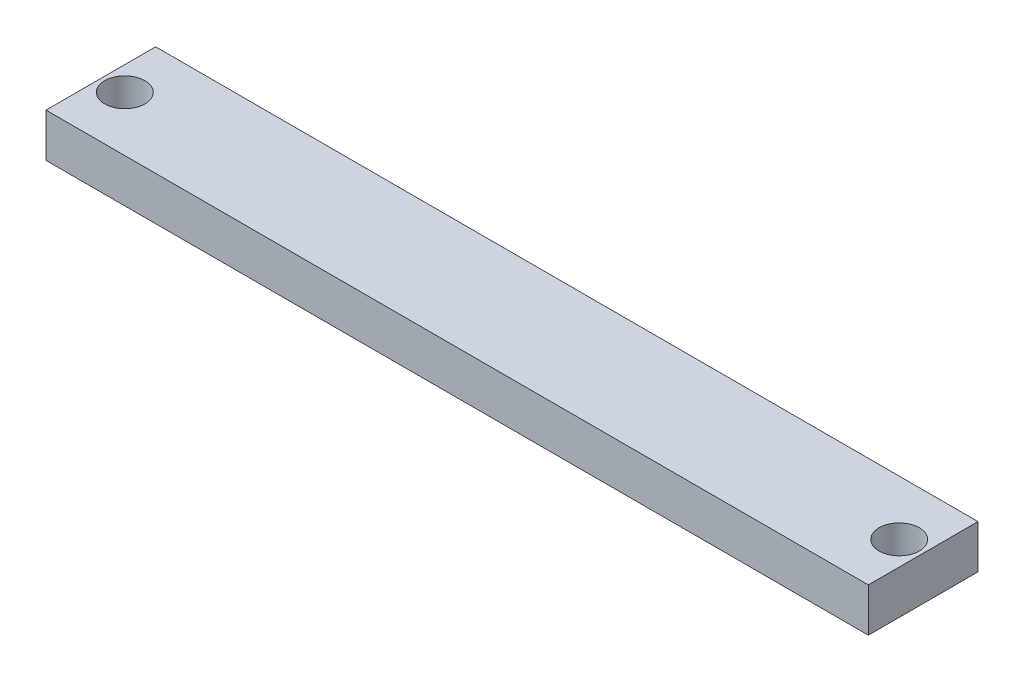
ISO-10303-21;
HEADER;
FILE_DESCRIPTION(('STEP AP214'),'2;1');
FILE_NAME('part.step','',(''),(''),'','','');
FILE_SCHEMA(('AUTOMOTIVE_DESIGN { 1 0 10303 214 1 1 1 1 }'));
ENDSEC;
DATA;
#1=APPLICATION_CONTEXT('core data for automotive mechanical design processes');
#2=APPLICATION_PROTOCOL_DEFINITION('international standard','automotive_design',2000,#1);
#3=PRODUCT_CONTEXT('',#1,'mechanical');
#4=PRODUCT('Part','Part','',(#3));
#5=PRODUCT_RELATED_PRODUCT_CATEGORY('part','',(#4));
#6=PRODUCT_DEFINITION_FORMATION('','',#4);
#7=PRODUCT_DEFINITION_CONTEXT('part definition',#1,'design');
#8=PRODUCT_DEFINITION('design','',#6,#7);
#9=PRODUCT_DEFINITION_SHAPE('','',#8);
#10=(LENGTH_UNIT() NAMED_UNIT(*) SI_UNIT(.MILLI.,.METRE.));
#11=(NAMED_UNIT(*) PLANE_ANGLE_UNIT() SI_UNIT($,.RADIAN.));
#12=(NAMED_UNIT(*) SI_UNIT($,.STERADIAN.) SOLID_ANGLE_UNIT());
#13=UNCERTAINTY_MEASURE_WITH_UNIT(LENGTH_MEASURE(1.E-05),#10,'distance_accuracy_value','');
#14=(GEOMETRIC_REPRESENTATION_CONTEXT(3) GLOBAL_UNCERTAINTY_ASSIGNED_CONTEXT((#13)) GLOBAL_UNIT_ASSIGNED_CONTEXT((#10,
#11,#12)) REPRESENTATION_CONTEXT('',''));
#15=CARTESIAN_POINT('',(0.,0.,0.));
#16=DIRECTION('',(0.,0.,1.));
#17=DIRECTION('',(1.,0.,0.));
#18=AXIS2_PLACEMENT_3D('',#15,#16,#17);
#19=CARTESIAN_POINT('',(0.,3.18,0.));
#20=DIRECTION('',(0.,1.,0.));
#21=DIRECTION('',(0.,0.,1.));
#22=AXIS2_PLACEMENT_3D('',#19,#20,#21);
#23=PLANE('',#22);
#24=CARTESIAN_POINT('',(-28.25,3.18,0.));
#25=DIRECTION('',(0.,1.,0.));
#26=DIRECTION('',(0.,0.,1.));
#27=AXIS2_PLACEMENT_3D('',#24,#25,#26);
#28=CIRCLE('',#27,1.47);
#29=CARTESIAN_POINT('',(-28.25,3.18,-1.47));
#30=VERTEX_POINT('',#29);
#31=EDGE_CURVE('E112',#30,#30,#28,.T.);
#32=ORIENTED_EDGE('',*,*,#31,.F.);
#33=EDGE_LOOP('',(#32));
#34=FACE_BOUND('',#33,.T.);
#35=DIRECTION('',(0.,0.,-1.));
#36=VECTOR('',#35,1.);
#37=CARTESIAN_POINT('',(30.,3.18,-4.));
#38=LINE('',#37,#36);
#39=CARTESIAN_POINT('',(30.,3.18,4.));
#40=VERTEX_POINT('',#39);
#41=CARTESIAN_POINT('',(30.,3.18,-4.));
#42=VERTEX_POINT('',#41);
#43=EDGE_CURVE('E92',#40,#42,#38,.T.);
#44=ORIENTED_EDGE('',*,*,#43,.T.);
#45=DIRECTION('',(-1.,0.,0.));
#46=VECTOR('',#45,1.);
#47=CARTESIAN_POINT('',(-30.,3.18,-4.));
#48=LINE('',#47,#46);
#49=CARTESIAN_POINT('',(-30.,3.18,-4.));
#50=VERTEX_POINT('',#49);
#51=EDGE_CURVE('E87',#42,#50,#48,.T.);
#52=ORIENTED_EDGE('',*,*,#51,.T.);
#53=DIRECTION('',(0.,0.,1.));
#54=VECTOR('',#53,1.);
#55=CARTESIAN_POINT('',(-30.,3.18,-4.));
#56=LINE('',#55,#54);
#57=CARTESIAN_POINT('',(-30.,3.18,4.));
#58=VERTEX_POINT('',#57);
#59=EDGE_CURVE('E90',#50,#58,#56,.T.);
#60=ORIENTED_EDGE('',*,*,#59,.T.);
#61=DIRECTION('',(1.,0.,0.));
#62=VECTOR('',#61,1.);
#63=CARTESIAN_POINT('',(-30.,3.18,4.));
#64=LINE('',#63,#62);
#65=EDGE_CURVE('E57',#58,#40,#64,.T.);
#66=ORIENTED_EDGE('',*,*,#65,.T.);
#67=EDGE_LOOP('',(#44,#52,#60,#66));
#68=FACE_BOUND('',#67,.T.);
#69=CARTESIAN_POINT('',(28.25,3.18,0.));
#70=DIRECTION('',(0.,1.,0.));
#71=DIRECTION('',(0.,0.,-1.));
#72=AXIS2_PLACEMENT_3D('',#69,#70,#71);
#73=CIRCLE('',#72,1.47);
#74=CARTESIAN_POINT('',(28.25,3.18,-1.47));
#75=VERTEX_POINT('',#74);
#76=EDGE_CURVE('E134',#75,#75,#73,.T.);
#77=ORIENTED_EDGE('',*,*,#76,.F.);
#78=EDGE_LOOP('',(#77));
#79=FACE_BOUND('',#78,.T.);
#80=ADVANCED_FACE('F39',(#34,#68,#79),#23,.T.);
#81=CARTESIAN_POINT('',(0.,0.,0.));
#82=DIRECTION('',(0.,1.,0.));
#83=DIRECTION('',(0.,0.,1.));
#84=AXIS2_PLACEMENT_3D('',#81,#82,#83);
#85=PLANE('',#84);
#86=DIRECTION('',(0.,0.,-1.));
#87=VECTOR('',#86,1.);
#88=CARTESIAN_POINT('',(30.,0.,-4.));
#89=LINE('',#88,#87);
#90=CARTESIAN_POINT('',(30.,0.,4.));
#91=VERTEX_POINT('',#90);
#92=CARTESIAN_POINT('',(30.,0.,-4.));
#93=VERTEX_POINT('',#92);
#94=EDGE_CURVE('E108',#91,#93,#89,.T.);
#95=ORIENTED_EDGE('',*,*,#94,.F.);
#96=DIRECTION('',(1.,0.,0.));
#97=VECTOR('',#96,1.);
#98=CARTESIAN_POINT('',(-30.,0.,4.));
#99=LINE('',#98,#97);
#100=CARTESIAN_POINT('',(-30.,0.,4.));
#101=VERTEX_POINT('',#100);
#102=EDGE_CURVE('E80',#101,#91,#99,.T.);
#103=ORIENTED_EDGE('',*,*,#102,.F.);
#104=DIRECTION('',(0.,0.,1.));
#105=VECTOR('',#104,1.);
#106=CARTESIAN_POINT('',(-30.,0.,-4.));
#107=LINE('',#106,#105);
#108=CARTESIAN_POINT('',(-30.,0.,-4.));
#109=VERTEX_POINT('',#108);
#110=EDGE_CURVE('E74',#109,#101,#107,.T.);
#111=ORIENTED_EDGE('',*,*,#110,.F.);
#112=DIRECTION('',(-1.,0.,0.));
#113=VECTOR('',#112,1.);
#114=CARTESIAN_POINT('',(-30.,0.,-4.));
#115=LINE('',#114,#113);
#116=EDGE_CURVE('E97',#93,#109,#115,.T.);
#117=ORIENTED_EDGE('',*,*,#116,.F.);
#118=EDGE_LOOP('',(#95,#103,#111,#117));
#119=FACE_BOUND('',#118,.T.);
#120=CARTESIAN_POINT('',(-28.25,0.,0.));
#121=DIRECTION('',(0.,1.,0.));
#122=DIRECTION('',(0.,0.,1.));
#123=AXIS2_PLACEMENT_3D('',#120,#121,#122);
#124=CIRCLE('',#123,1.47);
#125=CARTESIAN_POINT('',(-28.25,0.,-1.47));
#126=VERTEX_POINT('',#125);
#127=EDGE_CURVE('E130',#126,#126,#124,.T.);
#128=ORIENTED_EDGE('',*,*,#127,.T.);
#129=EDGE_LOOP('',(#128));
#130=FACE_BOUND('',#129,.T.);
#131=CARTESIAN_POINT('',(28.25,0.,0.));
#132=DIRECTION('',(0.,1.,0.));
#133=DIRECTION('',(0.,0.,-1.));
#134=AXIS2_PLACEMENT_3D('',#131,#132,#133);
#135=CIRCLE('',#134,1.47);
#136=CARTESIAN_POINT('',(28.25,0.,-1.47));
#137=VERTEX_POINT('',#136);
#138=EDGE_CURVE('E138',#137,#137,#135,.T.);
#139=ORIENTED_EDGE('',*,*,#138,.T.);
#140=EDGE_LOOP('',(#139));
#141=FACE_BOUND('',#140,.T.);
#142=ADVANCED_FACE('F125',(#119,#130,#141),#85,.F.);
#143=CARTESIAN_POINT('',(30.,3.18,-4.));
#144=DIRECTION('',(-1.,0.,0.));
#145=DIRECTION('',(0.,0.,1.));
#146=AXIS2_PLACEMENT_3D('',#143,#144,#145);
#147=PLANE('',#146);
#148=ORIENTED_EDGE('',*,*,#94,.T.);
#149=DIRECTION('',(0.,-1.,0.));
#150=VECTOR('',#149,1.);
#151=CARTESIAN_POINT('',(30.,3.18,-4.));
#152=LINE('',#151,#150);
#153=EDGE_CURVE('E11',#42,#93,#152,.T.);
#154=ORIENTED_EDGE('',*,*,#153,.F.);
#155=ORIENTED_EDGE('',*,*,#43,.F.);
#156=DIRECTION('',(0.,-1.,0.));
#157=VECTOR('',#156,1.);
#158=CARTESIAN_POINT('',(30.,3.18,4.));
#159=LINE('',#158,#157);
#160=EDGE_CURVE('E104',#40,#91,#159,.T.);
#161=ORIENTED_EDGE('',*,*,#160,.T.);
#162=EDGE_LOOP('',(#148,#154,#155,#161));
#163=FACE_BOUND('',#162,.T.);
#164=ADVANCED_FACE('F41',(#163),#147,.F.);
#165=CARTESIAN_POINT('',(-30.,3.18,-4.));
#166=DIRECTION('',(0.,0.,1.));
#167=DIRECTION('',(1.,0.,0.));
#168=AXIS2_PLACEMENT_3D('',#165,#166,#167);
#169=PLANE('',#168);
#170=ORIENTED_EDGE('',*,*,#116,.T.);
#171=DIRECTION('',(0.,-1.,0.));
#172=VECTOR('',#171,1.);
#173=CARTESIAN_POINT('',(-30.,3.18,-4.));
#174=LINE('',#173,#172);
#175=EDGE_CURVE('E49',#50,#109,#174,.T.);
#176=ORIENTED_EDGE('',*,*,#175,.F.);
#177=ORIENTED_EDGE('',*,*,#51,.F.);
#178=ORIENTED_EDGE('',*,*,#153,.T.);
#179=EDGE_LOOP('',(#170,#176,#177,#178));
#180=FACE_BOUND('',#179,.T.);
#181=ADVANCED_FACE('F96',(#180),#169,.F.);
#182=CARTESIAN_POINT('',(-30.,3.18,-4.));
#183=DIRECTION('',(1.,0.,0.));
#184=DIRECTION('',(0.,0.,-1.));
#185=AXIS2_PLACEMENT_3D('',#182,#183,#184);
#186=PLANE('',#185);
#187=ORIENTED_EDGE('',*,*,#110,.T.);
#188=DIRECTION('',(0.,-1.,0.));
#189=VECTOR('',#188,1.);
#190=CARTESIAN_POINT('',(-30.,3.18,4.));
#191=LINE('',#190,#189);
#192=EDGE_CURVE('E99',#58,#101,#191,.T.);
#193=ORIENTED_EDGE('',*,*,#192,.F.);
#194=ORIENTED_EDGE('',*,*,#59,.F.);
#195=ORIENTED_EDGE('',*,*,#175,.T.);
#196=EDGE_LOOP('',(#187,#193,#194,#195));
#197=FACE_BOUND('',#196,.T.);
#198=ADVANCED_FACE('F100',(#197),#186,.F.);
#199=CARTESIAN_POINT('',(-30.,3.18,4.));
#200=DIRECTION('',(0.,0.,-1.));
#201=DIRECTION('',(-1.,0.,0.));
#202=AXIS2_PLACEMENT_3D('',#199,#200,#201);
#203=PLANE('',#202);
#204=ORIENTED_EDGE('',*,*,#102,.T.);
#205=ORIENTED_EDGE('',*,*,#160,.F.);
#206=ORIENTED_EDGE('',*,*,#65,.F.);
#207=ORIENTED_EDGE('',*,*,#192,.T.);
#208=EDGE_LOOP('',(#204,#205,#206,#207));
#209=FACE_BOUND('',#208,.T.);
#210=ADVANCED_FACE('F122',(#209),#203,.F.);
#211=CARTESIAN_POINT('',(-28.25,3.18,0.));
#212=DIRECTION('',(0.,-1.,0.));
#213=DIRECTION('',(0.,0.,-1.));
#214=AXIS2_PLACEMENT_3D('',#211,#212,#213);
#215=CYLINDRICAL_SURFACE('',#214,1.47);
#216=CARTESIAN_POINT('',(-28.25,3.18,-1.47));
#217=CARTESIAN_POINT('',(-28.25,3.146875,-1.47));
#218=CARTESIAN_POINT('',(-28.25,3.11375,-1.47));
#219=CARTESIAN_POINT('',(-28.25,3.0475,-1.47));
#220=CARTESIAN_POINT('',(-28.25,3.014375,-1.47));
#221=CARTESIAN_POINT('',(-28.25,2.948125,-1.47));
#222=CARTESIAN_POINT('',(-28.25,2.915,-1.47));
#223=CARTESIAN_POINT('',(-28.25,2.84875,-1.47));
#224=CARTESIAN_POINT('',(-28.25,2.815625,-1.47));
#225=CARTESIAN_POINT('',(-28.25,2.749375,-1.47));
#226=CARTESIAN_POINT('',(-28.25,2.71625,-1.47));
#227=CARTESIAN_POINT('',(-28.25,2.65,-1.47));
#228=CARTESIAN_POINT('',(-28.25,2.616875,-1.47));
#229=CARTESIAN_POINT('',(-28.25,2.550625,-1.47));
#230=CARTESIAN_POINT('',(-28.25,2.5175,-1.47));
#231=CARTESIAN_POINT('',(-28.25,2.45125,-1.47));
#232=CARTESIAN_POINT('',(-28.25,2.418125,-1.47));
#233=CARTESIAN_POINT('',(-28.25,2.351875,-1.47));
#234=CARTESIAN_POINT('',(-28.25,2.31875,-1.47));
#235=CARTESIAN_POINT('',(-28.25,2.2525,-1.47));
#236=CARTESIAN_POINT('',(-28.25,2.219375,-1.47));
#237=CARTESIAN_POINT('',(-28.25,2.153125,-1.47));
#238=CARTESIAN_POINT('',(-28.25,2.12,-1.47));
#239=CARTESIAN_POINT('',(-28.25,2.05375,-1.47));
#240=CARTESIAN_POINT('',(-28.25,2.020625,-1.47));
#241=CARTESIAN_POINT('',(-28.25,1.954375,-1.47));
#242=CARTESIAN_POINT('',(-28.25,1.92125,-1.47));
#243=CARTESIAN_POINT('',(-28.25,1.855,-1.47));
#244=CARTESIAN_POINT('',(-28.25,1.821875,-1.47));
#245=CARTESIAN_POINT('',(-28.25,1.755625,-1.47));
#246=CARTESIAN_POINT('',(-28.25,1.7225,-1.47));
#247=CARTESIAN_POINT('',(-28.25,1.65625,-1.47));
#248=CARTESIAN_POINT('',(-28.25,1.623125,-1.47));
#249=CARTESIAN_POINT('',(-28.25,1.556875,-1.47));
#250=CARTESIAN_POINT('',(-28.25,1.52375,-1.47));
#251=CARTESIAN_POINT('',(-28.25,1.4575,-1.47));
#252=CARTESIAN_POINT('',(-28.25,1.424375,-1.47));
#253=CARTESIAN_POINT('',(-28.25,1.358125,-1.47));
#254=CARTESIAN_POINT('',(-28.25,1.325,-1.47));
#255=CARTESIAN_POINT('',(-28.25,1.25875,-1.47));
#256=CARTESIAN_POINT('',(-28.25,1.225625,-1.47));
#257=CARTESIAN_POINT('',(-28.25,1.159375,-1.47));
#258=CARTESIAN_POINT('',(-28.25,1.12625,-1.47));
#259=CARTESIAN_POINT('',(-28.25,1.06,-1.47));
#260=CARTESIAN_POINT('',(-28.25,1.026875,-1.47));
#261=CARTESIAN_POINT('',(-28.25,0.960625,-1.47));
#262=CARTESIAN_POINT('',(-28.25,0.9275,-1.47));
#263=CARTESIAN_POINT('',(-28.25,0.86125,-1.47));
#264=CARTESIAN_POINT('',(-28.25,0.828125,-1.47));
#265=CARTESIAN_POINT('',(-28.25,0.761875,-1.47));
#266=CARTESIAN_POINT('',(-28.25,0.72875,-1.47));
#267=CARTESIAN_POINT('',(-28.25,0.6625,-1.47));
#268=CARTESIAN_POINT('',(-28.25,0.629375,-1.47));
#269=CARTESIAN_POINT('',(-28.25,0.563125,-1.47));
#270=CARTESIAN_POINT('',(-28.25,0.53,-1.47));
#271=CARTESIAN_POINT('',(-28.25,0.46375,-1.47));
#272=CARTESIAN_POINT('',(-28.25,0.430625,-1.47));
#273=CARTESIAN_POINT('',(-28.25,0.364375,-1.47));
#274=CARTESIAN_POINT('',(-28.25,0.33125,-1.47));
#275=CARTESIAN_POINT('',(-28.25,0.265,-1.47));
#276=CARTESIAN_POINT('',(-28.25,0.231875,-1.47));
#277=CARTESIAN_POINT('',(-28.25,0.165625,-1.47));
#278=CARTESIAN_POINT('',(-28.25,0.1325,-1.47));
#279=CARTESIAN_POINT('',(-28.25,0.06625,-1.47));
#280=CARTESIAN_POINT('',(-28.25,0.033125,-1.47));
#281=CARTESIAN_POINT('',(-28.25,0.,-1.47));
#282=B_SPLINE_CURVE_WITH_KNOTS('',3,(#216,#217,#218,#219,#220,#221,#222,#223,#224,#225,#226,
#227,#228,#229,#230,#231,#232,#233,#234,#235,#236,#237,#238,#239,#240,#241,#242,#243,#244,#245,
#246,#247,#248,#249,#250,#251,#252,#253,#254,#255,#256,#257,#258,#259,#260,#261,#262,#263,#264,
#265,#266,#267,#268,#269,#270,#271,#272,#273,#274,#275,#276,#277,#278,#279,#280,#281),
.UNSPECIFIED.,.F.,.F.,(4,2,2,2,2,2,2,2,2,2,2,2,2,2,2,2,2,2,2,2,2,2,2,2,2,2,2,2,2,2,2,2,4),(0.,
0.0993750000000001,0.19875,0.298125,0.3975,0.496875,0.59625,0.695625,0.795,0.894375,0.99375,
1.093125,1.1925,1.291875,1.39125,1.490625,1.59,1.689375,1.78875,1.888125,1.9875,2.086875,
2.18625,2.285625,2.385,2.484375,2.58375,2.683125,2.7825,2.881875,2.98125,3.080625,3.18),.UNSPECIFIED.);
#283=EDGE_CURVE('BSEAM157',#30,#126,#282,.T.);
#284=ORIENTED_EDGE('',*,*,#31,.T.);
#285=ORIENTED_EDGE('',*,*,#127,.F.);
#286=ORIENTED_EDGE('',*,*,#283,.T.);
#287=ORIENTED_EDGE('',*,*,#283,.F.);
#288=EDGE_LOOP('',(#284,#286,#285,#287));
#289=FACE_BOUND('',#288,.T.);
#290=ADVANCED_FACE('F157',(#289),#215,.F.);
#291=CARTESIAN_POINT('',(28.25,3.18,0.));
#292=DIRECTION('',(0.,-1.,0.));
#293=DIRECTION('',(0.,0.,-1.));
#294=AXIS2_PLACEMENT_3D('',#291,#292,#293);
#295=CYLINDRICAL_SURFACE('',#294,1.47);
#296=CARTESIAN_POINT('',(28.25,3.18,-1.47));
#297=CARTESIAN_POINT('',(28.25,3.146875,-1.47));
#298=CARTESIAN_POINT('',(28.25,3.11375,-1.47));
#299=CARTESIAN_POINT('',(28.25,3.0475,-1.47));
#300=CARTESIAN_POINT('',(28.25,3.014375,-1.47));
#301=CARTESIAN_POINT('',(28.25,2.948125,-1.47));
#302=CARTESIAN_POINT('',(28.25,2.915,-1.47));
#303=CARTESIAN_POINT('',(28.25,2.84875,-1.47));
#304=CARTESIAN_POINT('',(28.25,2.815625,-1.47));
#305=CARTESIAN_POINT('',(28.25,2.749375,-1.47));
#306=CARTESIAN_POINT('',(28.25,2.71625,-1.47));
#307=CARTESIAN_POINT('',(28.25,2.65,-1.47));
#308=CARTESIAN_POINT('',(28.25,2.616875,-1.47));
#309=CARTESIAN_POINT('',(28.25,2.550625,-1.47));
#310=CARTESIAN_POINT('',(28.25,2.5175,-1.47));
#311=CARTESIAN_POINT('',(28.25,2.45125,-1.47));
#312=CARTESIAN_POINT('',(28.25,2.418125,-1.47));
#313=CARTESIAN_POINT('',(28.25,2.351875,-1.47));
#314=CARTESIAN_POINT('',(28.25,2.31875,-1.47));
#315=CARTESIAN_POINT('',(28.25,2.2525,-1.47));
#316=CARTESIAN_POINT('',(28.25,2.219375,-1.47));
#317=CARTESIAN_POINT('',(28.25,2.153125,-1.47));
#318=CARTESIAN_POINT('',(28.25,2.12,-1.47));
#319=CARTESIAN_POINT('',(28.25,2.05375,-1.47));
#320=CARTESIAN_POINT('',(28.25,2.020625,-1.47));
#321=CARTESIAN_POINT('',(28.25,1.954375,-1.47));
#322=CARTESIAN_POINT('',(28.25,1.92125,-1.47));
#323=CARTESIAN_POINT('',(28.25,1.855,-1.47));
#324=CARTESIAN_POINT('',(28.25,1.821875,-1.47));
#325=CARTESIAN_POINT('',(28.25,1.755625,-1.47));
#326=CARTESIAN_POINT('',(28.25,1.7225,-1.47));
#327=CARTESIAN_POINT('',(28.25,1.65625,-1.47));
#328=CARTESIAN_POINT('',(28.25,1.623125,-1.47));
#329=CARTESIAN_POINT('',(28.25,1.556875,-1.47));
#330=CARTESIAN_POINT('',(28.25,1.52375,-1.47));
#331=CARTESIAN_POINT('',(28.25,1.4575,-1.47));
#332=CARTESIAN_POINT('',(28.25,1.424375,-1.47));
#333=CARTESIAN_POINT('',(28.25,1.358125,-1.47));
#334=CARTESIAN_POINT('',(28.25,1.325,-1.47));
#335=CARTESIAN_POINT('',(28.25,1.25875,-1.47));
#336=CARTESIAN_POINT('',(28.25,1.225625,-1.47));
#337=CARTESIAN_POINT('',(28.25,1.159375,-1.47));
#338=CARTESIAN_POINT('',(28.25,1.12625,-1.47));
#339=CARTESIAN_POINT('',(28.25,1.06,-1.47));
#340=CARTESIAN_POINT('',(28.25,1.026875,-1.47));
#341=CARTESIAN_POINT('',(28.25,0.960625,-1.47));
#342=CARTESIAN_POINT('',(28.25,0.9275,-1.47));
#343=CARTESIAN_POINT('',(28.25,0.86125,-1.47));
#344=CARTESIAN_POINT('',(28.25,0.828125,-1.47));
#345=CARTESIAN_POINT('',(28.25,0.761875,-1.47));
#346=CARTESIAN_POINT('',(28.25,0.72875,-1.47));
#347=CARTESIAN_POINT('',(28.25,0.6625,-1.47));
#348=CARTESIAN_POINT('',(28.25,0.629375,-1.47));
#349=CARTESIAN_POINT('',(28.25,0.563125,-1.47));
#350=CARTESIAN_POINT('',(28.25,0.53,-1.47));
#351=CARTESIAN_POINT('',(28.25,0.46375,-1.47));
#352=CARTESIAN_POINT('',(28.25,0.430625,-1.47));
#353=CARTESIAN_POINT('',(28.25,0.364375,-1.47));
#354=CARTESIAN_POINT('',(28.25,0.33125,-1.47));
#355=CARTESIAN_POINT('',(28.25,0.265,-1.47));
#356=CARTESIAN_POINT('',(28.25,0.231875,-1.47));
#357=CARTESIAN_POINT('',(28.25,0.165625,-1.47));
#358=CARTESIAN_POINT('',(28.25,0.1325,-1.47));
#359=CARTESIAN_POINT('',(28.25,0.06625,-1.47));
#360=CARTESIAN_POINT('',(28.25,0.033125,-1.47));
#361=CARTESIAN_POINT('',(28.25,0.,-1.47));
#362=B_SPLINE_CURVE_WITH_KNOTS('',3,(#296,#297,#298,#299,#300,#301,#302,#303,#304,#305,#306,
#307,#308,#309,#310,#311,#312,#313,#314,#315,#316,#317,#318,#319,#320,#321,#322,#323,#324,#325,
#326,#327,#328,#329,#330,#331,#332,#333,#334,#335,#336,#337,#338,#339,#340,#341,#342,#343,#344,
#345,#346,#347,#348,#349,#350,#351,#352,#353,#354,#355,#356,#357,#358,#359,#360,#361),
.UNSPECIFIED.,.F.,.F.,(4,2,2,2,2,2,2,2,2,2,2,2,2,2,2,2,2,2,2,2,2,2,2,2,2,2,2,2,2,2,2,2,4),(0.,
0.0993750000000001,0.19875,0.298125,0.3975,0.496875,0.59625,0.695625,0.795,0.894375,0.99375,
1.093125,1.1925,1.291875,1.39125,1.490625,1.59,1.689375,1.78875,1.888125,1.9875,2.086875,
2.18625,2.285625,2.385,2.484375,2.58375,2.683125,2.7825,2.881875,2.98125,3.080625,3.18),.UNSPECIFIED.);
#363=EDGE_CURVE('BSEAM146',#75,#137,#362,.T.);
#364=ORIENTED_EDGE('',*,*,#76,.T.);
#365=ORIENTED_EDGE('',*,*,#138,.F.);
#366=ORIENTED_EDGE('',*,*,#363,.T.);
#367=ORIENTED_EDGE('',*,*,#363,.F.);
#368=EDGE_LOOP('',(#364,#366,#365,#367));
#369=FACE_BOUND('',#368,.T.);
#370=ADVANCED_FACE('F146',(#369),#295,.F.);
#371=CLOSED_SHELL('',(#80,#142,#164,#181,#198,#210,#290,#370));
#372=MANIFOLD_SOLID_BREP('B2',#371);
#373=ADVANCED_BREP_SHAPE_REPRESENTATION('',(#18,#372),#14);
#374=SHAPE_DEFINITION_REPRESENTATION(#9,#373);
ENDSEC;
END-ISO-10303-21;
